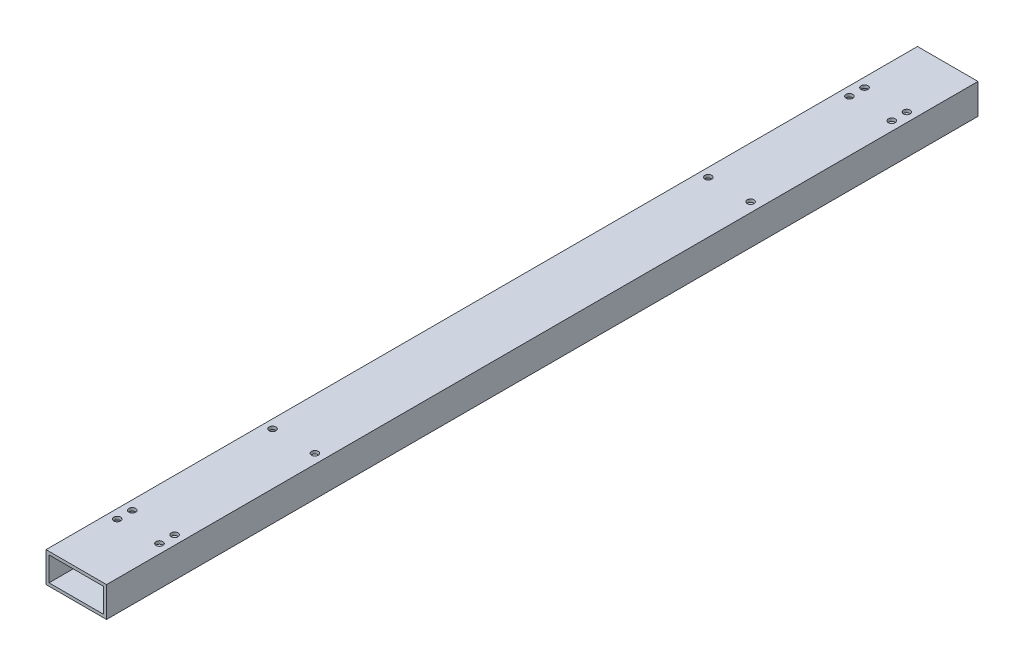
ISO-10303-21;
HEADER;
FILE_DESCRIPTION(('STEP AP214'),'2;1');
FILE_NAME('part.step','',(''),(''),'','','');
FILE_SCHEMA(('AUTOMOTIVE_DESIGN { 1 0 10303 214 1 1 1 1 }'));
ENDSEC;
DATA;
#1=APPLICATION_CONTEXT('core data for automotive mechanical design processes');
#2=APPLICATION_PROTOCOL_DEFINITION('international standard','automotive_design',2000,#1);
#3=PRODUCT_CONTEXT('',#1,'mechanical');
#4=PRODUCT('Part','Part','',(#3));
#5=PRODUCT_RELATED_PRODUCT_CATEGORY('part','',(#4));
#6=PRODUCT_DEFINITION_FORMATION('','',#4);
#7=PRODUCT_DEFINITION_CONTEXT('part definition',#1,'design');
#8=PRODUCT_DEFINITION('design','',#6,#7);
#9=PRODUCT_DEFINITION_SHAPE('','',#8);
#10=(LENGTH_UNIT() NAMED_UNIT(*) SI_UNIT(.MILLI.,.METRE.));
#11=(NAMED_UNIT(*) PLANE_ANGLE_UNIT() SI_UNIT($,.RADIAN.));
#12=(NAMED_UNIT(*) SI_UNIT($,.STERADIAN.) SOLID_ANGLE_UNIT());
#13=UNCERTAINTY_MEASURE_WITH_UNIT(LENGTH_MEASURE(1.E-05),#10,'distance_accuracy_value','');
#14=(GEOMETRIC_REPRESENTATION_CONTEXT(3) GLOBAL_UNCERTAINTY_ASSIGNED_CONTEXT((#13)) GLOBAL_UNIT_ASSIGNED_CONTEXT((#10,
#11,#12)) REPRESENTATION_CONTEXT('',''));
#15=CARTESIAN_POINT('',(0.,0.,0.));
#16=DIRECTION('',(0.,0.,1.));
#17=DIRECTION('',(1.,0.,0.));
#18=AXIS2_PLACEMENT_3D('',#15,#16,#17);
#19=CARTESIAN_POINT('',(-31.7499999999999,15.875,457.2));
#20=DIRECTION('',(0.,-1.,0.));
#21=DIRECTION('',(1.,0.,0.));
#22=AXIS2_PLACEMENT_3D('',#19,#20,#21);
#23=PLANE('',#22);
#24=CARTESIAN_POINT('',(-22.6771014244706,15.875,-228.6));
#25=DIRECTION('',(0.,1.,0.));
#26=DIRECTION('',(-1.,0.,0.));
#27=AXIS2_PLACEMENT_3D('',#24,#25,#26);
#28=CIRCLE('',#27,3.57251000000004);
#29=CARTESIAN_POINT('',(-26.2496114244707,15.875,-228.6));
#30=VERTEX_POINT('',#29);
#31=EDGE_CURVE('E463',#30,#30,#28,.T.);
#32=ORIENTED_EDGE('',*,*,#31,.F.);
#33=EDGE_LOOP('',(#32));
#34=FACE_BOUND('',#33,.T.);
#35=CARTESIAN_POINT('',(21.7728985755294,15.875,228.6));
#36=DIRECTION('',(0.,1.,0.));
#37=DIRECTION('',(1.,0.,0.));
#38=AXIS2_PLACEMENT_3D('',#35,#36,#37);
#39=CIRCLE('',#38,3.57251000000004);
#40=CARTESIAN_POINT('',(25.3454085755295,15.875,228.6));
#41=VERTEX_POINT('',#40);
#42=EDGE_CURVE('E455',#41,#41,#39,.T.);
#43=ORIENTED_EDGE('',*,*,#42,.F.);
#44=EDGE_LOOP('',(#43));
#45=FACE_BOUND('',#44,.T.);
#46=CARTESIAN_POINT('',(-22.6771014244706,15.875,228.6));
#47=DIRECTION('',(0.,1.,0.));
#48=DIRECTION('',(1.,0.,0.));
#49=AXIS2_PLACEMENT_3D('',#46,#47,#48);
#50=CIRCLE('',#49,3.57251000000004);
#51=CARTESIAN_POINT('',(-19.1045914244706,15.875,228.6));
#52=VERTEX_POINT('',#51);
#53=EDGE_CURVE('E449',#52,#52,#50,.T.);
#54=ORIENTED_EDGE('',*,*,#53,.F.);
#55=EDGE_LOOP('',(#54));
#56=FACE_BOUND('',#55,.T.);
#57=CARTESIAN_POINT('',(21.7728985755294,15.875,-228.6));
#58=DIRECTION('',(0.,1.,0.));
#59=DIRECTION('',(-1.,0.,0.));
#60=AXIS2_PLACEMENT_3D('',#57,#58,#59);
#61=CIRCLE('',#60,3.57251000000004);
#62=CARTESIAN_POINT('',(18.2003885755293,15.875,-228.6));
#63=VERTEX_POINT('',#62);
#64=EDGE_CURVE('E462',#63,#63,#61,.T.);
#65=ORIENTED_EDGE('',*,*,#64,.F.);
#66=EDGE_LOOP('',(#65));
#67=FACE_BOUND('',#66,.T.);
#68=CARTESIAN_POINT('',(-22.2250000000001,15.875,-376.2375));
#69=DIRECTION('',(0.,-1.,0.));
#70=DIRECTION('',(0.,0.,-1.));
#71=AXIS2_PLACEMENT_3D('',#68,#69,#70);
#72=CIRCLE('',#71,3.57187499999998);
#73=CARTESIAN_POINT('',(-22.2250000000001,15.875,-379.809375));
#74=VERTEX_POINT('',#73);
#75=EDGE_CURVE('E272',#74,#74,#72,.T.);
#76=ORIENTED_EDGE('',*,*,#75,.T.);
#77=EDGE_LOOP('',(#76));
#78=FACE_BOUND('',#77,.T.);
#79=CARTESIAN_POINT('',(22.2249999999999,15.875,392.1125));
#80=DIRECTION('',(0.,-1.,0.));
#81=DIRECTION('',(0.,0.,-1.));
#82=AXIS2_PLACEMENT_3D('',#79,#80,#81);
#83=CIRCLE('',#82,3.57187499999998);
#84=CARTESIAN_POINT('',(22.2249999999999,15.875,388.540625));
#85=VERTEX_POINT('',#84);
#86=EDGE_CURVE('E308',#85,#85,#83,.T.);
#87=ORIENTED_EDGE('',*,*,#86,.T.);
#88=EDGE_LOOP('',(#87));
#89=FACE_BOUND('',#88,.T.);
#90=CARTESIAN_POINT('',(22.2249999999999,15.875,-376.2375));
#91=DIRECTION('',(0.,-1.,0.));
#92=DIRECTION('',(0.,0.,-1.));
#93=AXIS2_PLACEMENT_3D('',#90,#91,#92);
#94=CIRCLE('',#93,3.57187499999998);
#95=CARTESIAN_POINT('',(22.2249999999999,15.875,-379.809375));
#96=VERTEX_POINT('',#95);
#97=EDGE_CURVE('E273',#96,#96,#94,.T.);
#98=ORIENTED_EDGE('',*,*,#97,.T.);
#99=EDGE_LOOP('',(#98));
#100=FACE_BOUND('',#99,.T.);
#101=CARTESIAN_POINT('',(-22.2250000000001,15.875,392.1125));
#102=DIRECTION('',(0.,-1.,0.));
#103=DIRECTION('',(0.,0.,-1.));
#104=AXIS2_PLACEMENT_3D('',#101,#102,#103);
#105=CIRCLE('',#104,3.57187499999998);
#106=CARTESIAN_POINT('',(-22.2250000000001,15.875,388.540625));
#107=VERTEX_POINT('',#106);
#108=EDGE_CURVE('E205',#107,#107,#105,.T.);
#109=ORIENTED_EDGE('',*,*,#108,.T.);
#110=EDGE_LOOP('',(#109));
#111=FACE_BOUND('',#110,.T.);
#112=DIRECTION('',(0.,0.,-1.));
#113=VECTOR('',#112,1.);
#114=CARTESIAN_POINT('',(31.75,15.875,457.2));
#115=LINE('',#114,#113);
#116=CARTESIAN_POINT('',(31.75,15.875,457.2));
#117=VERTEX_POINT('',#116);
#118=CARTESIAN_POINT('',(31.75,15.875,-457.2));
#119=VERTEX_POINT('',#118);
#120=EDGE_CURVE('E11',#117,#119,#115,.T.);
#121=ORIENTED_EDGE('',*,*,#120,.T.);
#122=DIRECTION('',(-1.,0.,0.));
#123=VECTOR('',#122,1.);
#124=CARTESIAN_POINT('',(-31.7499999999999,15.875,-457.2));
#125=LINE('',#124,#123);
#126=CARTESIAN_POINT('',(-31.7499999999999,15.875,-457.2));
#127=VERTEX_POINT('',#126);
#128=EDGE_CURVE('E155',#119,#127,#125,.T.);
#129=ORIENTED_EDGE('',*,*,#128,.T.);
#130=DIRECTION('',(0.,0.,-1.));
#131=VECTOR('',#130,1.);
#132=CARTESIAN_POINT('',(-31.7499999999999,15.875,457.2));
#133=LINE('',#132,#131);
#134=CARTESIAN_POINT('',(-31.7499999999999,15.875,457.2));
#135=VERTEX_POINT('',#134);
#136=EDGE_CURVE('E51',#135,#127,#133,.T.);
#137=ORIENTED_EDGE('',*,*,#136,.F.);
#138=DIRECTION('',(-1.,0.,0.));
#139=VECTOR('',#138,1.);
#140=CARTESIAN_POINT('',(-31.7499999999999,15.875,457.2));
#141=LINE('',#140,#139);
#142=EDGE_CURVE('E184',#117,#135,#141,.T.);
#143=ORIENTED_EDGE('',*,*,#142,.F.);
#144=EDGE_LOOP('',(#121,#129,#137,#143));
#145=FACE_BOUND('',#144,.T.);
#146=CARTESIAN_POINT('',(-22.2250000000001,15.875,376.2375));
#147=DIRECTION('',(0.,1.,0.));
#148=DIRECTION('',(0.,0.,1.));
#149=AXIS2_PLACEMENT_3D('',#146,#147,#148);
#150=CIRCLE('',#149,3.57187499999998);
#151=CARTESIAN_POINT('',(-22.2250000000001,15.875,379.809375));
#152=VERTEX_POINT('',#151);
#153=EDGE_CURVE('E268',#152,#152,#150,.T.);
#154=ORIENTED_EDGE('',*,*,#153,.F.);
#155=EDGE_LOOP('',(#154));
#156=FACE_BOUND('',#155,.T.);
#157=CARTESIAN_POINT('',(22.2249999999999,15.875,376.2375));
#158=DIRECTION('',(0.,1.,0.));
#159=DIRECTION('',(0.,0.,1.));
#160=AXIS2_PLACEMENT_3D('',#157,#158,#159);
#161=CIRCLE('',#160,3.57187499999998);
#162=CARTESIAN_POINT('',(22.2249999999999,15.875,379.809375));
#163=VERTEX_POINT('',#162);
#164=EDGE_CURVE('E280',#163,#163,#161,.T.);
#165=ORIENTED_EDGE('',*,*,#164,.F.);
#166=EDGE_LOOP('',(#165));
#167=FACE_BOUND('',#166,.T.);
#168=CARTESIAN_POINT('',(-22.2250000000001,15.875,-392.1125));
#169=DIRECTION('',(0.,1.,0.));
#170=DIRECTION('',(0.,0.,1.));
#171=AXIS2_PLACEMENT_3D('',#168,#169,#170);
#172=CIRCLE('',#171,3.57187499999998);
#173=CARTESIAN_POINT('',(-22.2250000000001,15.875,-388.540625));
#174=VERTEX_POINT('',#173);
#175=EDGE_CURVE('E294',#174,#174,#172,.T.);
#176=ORIENTED_EDGE('',*,*,#175,.F.);
#177=EDGE_LOOP('',(#176));
#178=FACE_BOUND('',#177,.T.);
#179=CARTESIAN_POINT('',(22.2249999999999,15.875,-392.1125));
#180=DIRECTION('',(0.,1.,0.));
#181=DIRECTION('',(0.,0.,1.));
#182=AXIS2_PLACEMENT_3D('',#179,#180,#181);
#183=CIRCLE('',#182,3.57187499999998);
#184=CARTESIAN_POINT('',(22.2249999999999,15.875,-388.540625));
#185=VERTEX_POINT('',#184);
#186=EDGE_CURVE('E295',#185,#185,#183,.T.);
#187=ORIENTED_EDGE('',*,*,#186,.F.);
#188=EDGE_LOOP('',(#187));
#189=FACE_BOUND('',#188,.T.);
#190=ADVANCED_FACE('F41',(#34,#45,#56,#67,#78,#89,#100,#111,#145,#156,#167,#178,#189),#23,.F.);
#191=CARTESIAN_POINT('',(-31.75,-15.875,457.2));
#192=DIRECTION('',(0.,1.,0.));
#193=DIRECTION('',(0.,0.,1.));
#194=AXIS2_PLACEMENT_3D('',#191,#192,#193);
#195=PLANE('',#194);
#196=CARTESIAN_POINT('',(-22.6771014244706,-15.875,-228.6));
#197=DIRECTION('',(0.,1.,0.));
#198=DIRECTION('',(-1.,0.,0.));
#199=AXIS2_PLACEMENT_3D('',#196,#197,#198);
#200=CIRCLE('',#199,3.57251000000004);
#201=CARTESIAN_POINT('',(-26.2496114244707,-15.875,-228.6));
#202=VERTEX_POINT('',#201);
#203=EDGE_CURVE('E458',#202,#202,#200,.T.);
#204=ORIENTED_EDGE('',*,*,#203,.T.);
#205=EDGE_LOOP('',(#204));
#206=FACE_BOUND('',#205,.T.);
#207=CARTESIAN_POINT('',(21.7728985755294,-15.875,228.6));
#208=DIRECTION('',(0.,1.,0.));
#209=DIRECTION('',(1.,0.,0.));
#210=AXIS2_PLACEMENT_3D('',#207,#208,#209);
#211=CIRCLE('',#210,3.57251000000004);
#212=CARTESIAN_POINT('',(25.3454085755295,-15.875,228.6));
#213=VERTEX_POINT('',#212);
#214=EDGE_CURVE('E467',#213,#213,#211,.T.);
#215=ORIENTED_EDGE('',*,*,#214,.T.);
#216=EDGE_LOOP('',(#215));
#217=FACE_BOUND('',#216,.T.);
#218=CARTESIAN_POINT('',(-22.6771014244706,-15.875,228.6));
#219=DIRECTION('',(0.,1.,0.));
#220=DIRECTION('',(1.,0.,0.));
#221=AXIS2_PLACEMENT_3D('',#218,#219,#220);
#222=CIRCLE('',#221,3.57251000000004);
#223=CARTESIAN_POINT('',(-19.1045914244705,-15.875,228.6));
#224=VERTEX_POINT('',#223);
#225=EDGE_CURVE('E451',#224,#224,#222,.T.);
#226=ORIENTED_EDGE('',*,*,#225,.T.);
#227=EDGE_LOOP('',(#226));
#228=FACE_BOUND('',#227,.T.);
#229=CARTESIAN_POINT('',(21.7728985755294,-15.875,-228.6));
#230=DIRECTION('',(0.,1.,0.));
#231=DIRECTION('',(-1.,0.,0.));
#232=AXIS2_PLACEMENT_3D('',#229,#230,#231);
#233=CIRCLE('',#232,3.57251000000004);
#234=CARTESIAN_POINT('',(18.2003885755293,-15.875,-228.6));
#235=VERTEX_POINT('',#234);
#236=EDGE_CURVE('E240',#235,#235,#233,.T.);
#237=ORIENTED_EDGE('',*,*,#236,.T.);
#238=EDGE_LOOP('',(#237));
#239=FACE_BOUND('',#238,.T.);
#240=CARTESIAN_POINT('',(-22.2250000000001,-15.875,-376.2375));
#241=DIRECTION('',(0.,-1.,0.));
#242=DIRECTION('',(0.,0.,-1.));
#243=AXIS2_PLACEMENT_3D('',#240,#241,#242);
#244=CIRCLE('',#243,3.57187499999998);
#245=CARTESIAN_POINT('',(-22.2250000000001,-15.875,-379.809375));
#246=VERTEX_POINT('',#245);
#247=EDGE_CURVE('E298',#246,#246,#244,.T.);
#248=ORIENTED_EDGE('',*,*,#247,.F.);
#249=EDGE_LOOP('',(#248));
#250=FACE_BOUND('',#249,.T.);
#251=CARTESIAN_POINT('',(22.2249999999999,-15.875,392.1125));
#252=DIRECTION('',(0.,-1.,0.));
#253=DIRECTION('',(0.,0.,-1.));
#254=AXIS2_PLACEMENT_3D('',#251,#252,#253);
#255=CIRCLE('',#254,3.57187499999998);
#256=CARTESIAN_POINT('',(22.2249999999999,-15.875,388.540625));
#257=VERTEX_POINT('',#256);
#258=EDGE_CURVE('E303',#257,#257,#255,.T.);
#259=ORIENTED_EDGE('',*,*,#258,.F.);
#260=EDGE_LOOP('',(#259));
#261=FACE_BOUND('',#260,.T.);
#262=CARTESIAN_POINT('',(22.2249999999999,-15.875,-376.2375));
#263=DIRECTION('',(0.,-1.,0.));
#264=DIRECTION('',(0.,0.,-1.));
#265=AXIS2_PLACEMENT_3D('',#262,#263,#264);
#266=CIRCLE('',#265,3.57187499999998);
#267=CARTESIAN_POINT('',(22.2249999999999,-15.875,-379.809375));
#268=VERTEX_POINT('',#267);
#269=EDGE_CURVE('E269',#268,#268,#266,.T.);
#270=ORIENTED_EDGE('',*,*,#269,.F.);
#271=EDGE_LOOP('',(#270));
#272=FACE_BOUND('',#271,.T.);
#273=CARTESIAN_POINT('',(-22.2250000000001,-15.875,392.1125));
#274=DIRECTION('',(0.,-1.,0.));
#275=DIRECTION('',(0.,0.,-1.));
#276=AXIS2_PLACEMENT_3D('',#273,#274,#275);
#277=CIRCLE('',#276,3.57187499999998);
#278=CARTESIAN_POINT('',(-22.2250000000001,-15.875,388.540625));
#279=VERTEX_POINT('',#278);
#280=EDGE_CURVE('E307',#279,#279,#277,.T.);
#281=ORIENTED_EDGE('',*,*,#280,.F.);
#282=EDGE_LOOP('',(#281));
#283=FACE_BOUND('',#282,.T.);
#284=DIRECTION('',(0.,0.,-1.));
#285=VECTOR('',#284,1.);
#286=CARTESIAN_POINT('',(-31.75,-15.875,457.2));
#287=LINE('',#286,#285);
#288=CARTESIAN_POINT('',(-31.75,-15.875,457.2));
#289=VERTEX_POINT('',#288);
#290=CARTESIAN_POINT('',(-31.75,-15.875,-457.2));
#291=VERTEX_POINT('',#290);
#292=EDGE_CURVE('E195',#289,#291,#287,.T.);
#293=ORIENTED_EDGE('',*,*,#292,.T.);
#294=DIRECTION('',(1.,0.,0.));
#295=VECTOR('',#294,1.);
#296=CARTESIAN_POINT('',(-31.75,-15.875,-457.2));
#297=LINE('',#296,#295);
#298=CARTESIAN_POINT('',(31.75,-15.875,-457.2));
#299=VERTEX_POINT('',#298);
#300=EDGE_CURVE('E161',#291,#299,#297,.T.);
#301=ORIENTED_EDGE('',*,*,#300,.T.);
#302=DIRECTION('',(0.,0.,-1.));
#303=VECTOR('',#302,1.);
#304=CARTESIAN_POINT('',(31.75,-15.875,457.2));
#305=LINE('',#304,#303);
#306=CARTESIAN_POINT('',(31.75,-15.875,457.2));
#307=VERTEX_POINT('',#306);
#308=EDGE_CURVE('E192',#307,#299,#305,.T.);
#309=ORIENTED_EDGE('',*,*,#308,.F.);
#310=DIRECTION('',(1.,0.,0.));
#311=VECTOR('',#310,1.);
#312=CARTESIAN_POINT('',(-31.75,-15.875,457.2));
#313=LINE('',#312,#311);
#314=EDGE_CURVE('E70',#289,#307,#313,.T.);
#315=ORIENTED_EDGE('',*,*,#314,.F.);
#316=EDGE_LOOP('',(#293,#301,#309,#315));
#317=FACE_BOUND('',#316,.T.);
#318=CARTESIAN_POINT('',(-22.2250000000001,-15.875,376.2375));
#319=DIRECTION('',(0.,1.,0.));
#320=DIRECTION('',(0.,0.,1.));
#321=AXIS2_PLACEMENT_3D('',#318,#319,#320);
#322=CIRCLE('',#321,3.57187499999998);
#323=CARTESIAN_POINT('',(-22.2250000000001,-15.875,379.809375));
#324=VERTEX_POINT('',#323);
#325=EDGE_CURVE('E284',#324,#324,#322,.T.);
#326=ORIENTED_EDGE('',*,*,#325,.T.);
#327=EDGE_LOOP('',(#326));
#328=FACE_BOUND('',#327,.T.);
#329=CARTESIAN_POINT('',(22.2249999999999,-15.875,376.2375));
#330=DIRECTION('',(0.,1.,0.));
#331=DIRECTION('',(0.,0.,1.));
#332=AXIS2_PLACEMENT_3D('',#329,#330,#331);
#333=CIRCLE('',#332,3.57187499999998);
#334=CARTESIAN_POINT('',(22.2249999999999,-15.875,379.809375));
#335=VERTEX_POINT('',#334);
#336=EDGE_CURVE('E276',#335,#335,#333,.T.);
#337=ORIENTED_EDGE('',*,*,#336,.T.);
#338=EDGE_LOOP('',(#337));
#339=FACE_BOUND('',#338,.T.);
#340=CARTESIAN_POINT('',(-22.2250000000001,-15.875,-392.1125));
#341=DIRECTION('',(0.,1.,0.));
#342=DIRECTION('',(0.,0.,1.));
#343=AXIS2_PLACEMENT_3D('',#340,#341,#342);
#344=CIRCLE('',#343,3.57187499999998);
#345=CARTESIAN_POINT('',(-22.2250000000001,-15.875,-388.540625));
#346=VERTEX_POINT('',#345);
#347=EDGE_CURVE('E312',#346,#346,#344,.T.);
#348=ORIENTED_EDGE('',*,*,#347,.T.);
#349=EDGE_LOOP('',(#348));
#350=FACE_BOUND('',#349,.T.);
#351=CARTESIAN_POINT('',(22.2249999999999,-15.875,-392.1125));
#352=DIRECTION('',(0.,1.,0.));
#353=DIRECTION('',(0.,0.,1.));
#354=AXIS2_PLACEMENT_3D('',#351,#352,#353);
#355=CIRCLE('',#354,3.57187499999998);
#356=CARTESIAN_POINT('',(22.2249999999999,-15.875,-388.540625));
#357=VERTEX_POINT('',#356);
#358=EDGE_CURVE('E291',#357,#357,#355,.T.);
#359=ORIENTED_EDGE('',*,*,#358,.T.);
#360=EDGE_LOOP('',(#359));
#361=FACE_BOUND('',#360,.T.);
#362=ADVANCED_FACE('F352',(#206,#217,#228,#239,#250,#261,#272,#283,#317,#328,#339,#350,#361),
#195,.F.);
#363=CARTESIAN_POINT('',(-28.575,12.7,457.2));
#364=DIRECTION('',(0.,-1.,0.));
#365=DIRECTION('',(0.,0.,-1.));
#366=AXIS2_PLACEMENT_3D('',#363,#364,#365);
#367=PLANE('',#366);
#368=CARTESIAN_POINT('',(-22.6771014244706,12.7,-228.6));
#369=DIRECTION('',(0.,-1.,0.));
#370=DIRECTION('',(0.,0.,-1.));
#371=AXIS2_PLACEMENT_3D('',#368,#369,#370);
#372=CIRCLE('',#371,3.57251000000004);
#373=CARTESIAN_POINT('',(-22.6771014244706,12.7,-232.17251));
#374=VERTEX_POINT('',#373);
#375=EDGE_CURVE('E264',#374,#374,#372,.T.);
#376=ORIENTED_EDGE('',*,*,#375,.F.);
#377=EDGE_LOOP('',(#376));
#378=FACE_BOUND('',#377,.T.);
#379=CARTESIAN_POINT('',(21.7728985755294,12.7,228.6));
#380=DIRECTION('',(0.,-1.,0.));
#381=DIRECTION('',(0.,0.,-1.));
#382=AXIS2_PLACEMENT_3D('',#379,#380,#381);
#383=CIRCLE('',#382,3.57251000000004);
#384=CARTESIAN_POINT('',(21.7728985755294,12.7,225.02749));
#385=VERTEX_POINT('',#384);
#386=EDGE_CURVE('E248',#385,#385,#383,.T.);
#387=ORIENTED_EDGE('',*,*,#386,.F.);
#388=EDGE_LOOP('',(#387));
#389=FACE_BOUND('',#388,.T.);
#390=CARTESIAN_POINT('',(-22.6771014244706,12.7,228.6));
#391=DIRECTION('',(0.,-1.,0.));
#392=DIRECTION('',(0.,0.,-1.));
#393=AXIS2_PLACEMENT_3D('',#390,#391,#392);
#394=CIRCLE('',#393,3.57251000000004);
#395=CARTESIAN_POINT('',(-22.6771014244706,12.7,225.02749));
#396=VERTEX_POINT('',#395);
#397=EDGE_CURVE('E244',#396,#396,#394,.T.);
#398=ORIENTED_EDGE('',*,*,#397,.F.);
#399=EDGE_LOOP('',(#398));
#400=FACE_BOUND('',#399,.T.);
#401=CARTESIAN_POINT('',(21.7728985755294,12.7,-228.6));
#402=DIRECTION('',(0.,-1.,0.));
#403=DIRECTION('',(0.,0.,-1.));
#404=AXIS2_PLACEMENT_3D('',#401,#402,#403);
#405=CIRCLE('',#404,3.57251000000004);
#406=CARTESIAN_POINT('',(21.7728985755294,12.7,-232.17251));
#407=VERTEX_POINT('',#406);
#408=EDGE_CURVE('E239',#407,#407,#405,.T.);
#409=ORIENTED_EDGE('',*,*,#408,.F.);
#410=EDGE_LOOP('',(#409));
#411=FACE_BOUND('',#410,.T.);
#412=CARTESIAN_POINT('',(-22.2250000000001,12.7,-376.2375));
#413=DIRECTION('',(0.,-1.,0.));
#414=DIRECTION('',(0.,0.,-1.));
#415=AXIS2_PLACEMENT_3D('',#412,#413,#414);
#416=CIRCLE('',#415,3.57187499999998);
#417=CARTESIAN_POINT('',(-22.2250000000001,12.7,-379.809375));
#418=VERTEX_POINT('',#417);
#419=EDGE_CURVE('E143',#418,#418,#416,.T.);
#420=ORIENTED_EDGE('',*,*,#419,.F.);
#421=EDGE_LOOP('',(#420));
#422=FACE_BOUND('',#421,.T.);
#423=CARTESIAN_POINT('',(-22.2250000000001,12.7,-392.1125));
#424=DIRECTION('',(0.,-1.,0.));
#425=DIRECTION('',(0.,0.,-1.));
#426=AXIS2_PLACEMENT_3D('',#423,#424,#425);
#427=CIRCLE('',#426,3.57187499999998);
#428=CARTESIAN_POINT('',(-22.2250000000001,12.7,-395.684375));
#429=VERTEX_POINT('',#428);
#430=EDGE_CURVE('E228',#429,#429,#427,.F.);
#431=ORIENTED_EDGE('',*,*,#430,.T.);
#432=EDGE_LOOP('',(#431));
#433=FACE_BOUND('',#432,.T.);
#434=CARTESIAN_POINT('',(22.2249999999999,12.7,392.1125));
#435=DIRECTION('',(0.,-1.,0.));
#436=DIRECTION('',(0.,0.,-1.));
#437=AXIS2_PLACEMENT_3D('',#434,#435,#436);
#438=CIRCLE('',#437,3.57187499999998);
#439=CARTESIAN_POINT('',(22.2249999999999,12.7,388.540625));
#440=VERTEX_POINT('',#439);
#441=EDGE_CURVE('E224',#440,#440,#438,.T.);
#442=ORIENTED_EDGE('',*,*,#441,.F.);
#443=EDGE_LOOP('',(#442));
#444=FACE_BOUND('',#443,.T.);
#445=CARTESIAN_POINT('',(22.2249999999999,12.7,-376.2375));
#446=DIRECTION('',(0.,-1.,0.));
#447=DIRECTION('',(0.,0.,-1.));
#448=AXIS2_PLACEMENT_3D('',#445,#446,#447);
#449=CIRCLE('',#448,3.57187499999998);
#450=CARTESIAN_POINT('',(22.2249999999999,12.7,-379.809375));
#451=VERTEX_POINT('',#450);
#452=EDGE_CURVE('E219',#451,#451,#449,.T.);
#453=ORIENTED_EDGE('',*,*,#452,.F.);
#454=EDGE_LOOP('',(#453));
#455=FACE_BOUND('',#454,.T.);
#456=CARTESIAN_POINT('',(-22.2250000000001,12.7,376.2375));
#457=DIRECTION('',(0.,-1.,0.));
#458=DIRECTION('',(0.,0.,-1.));
#459=AXIS2_PLACEMENT_3D('',#456,#457,#458);
#460=CIRCLE('',#459,3.57187499999998);
#461=CARTESIAN_POINT('',(-22.2250000000001,12.7,372.665625));
#462=VERTEX_POINT('',#461);
#463=EDGE_CURVE('E210',#462,#462,#460,.F.);
#464=ORIENTED_EDGE('',*,*,#463,.T.);
#465=EDGE_LOOP('',(#464));
#466=FACE_BOUND('',#465,.T.);
#467=CARTESIAN_POINT('',(-22.2250000000001,12.7,392.1125));
#468=DIRECTION('',(0.,-1.,0.));
#469=DIRECTION('',(0.,0.,-1.));
#470=AXIS2_PLACEMENT_3D('',#467,#468,#469);
#471=CIRCLE('',#470,3.57187499999998);
#472=CARTESIAN_POINT('',(-22.2250000000001,12.7,388.540625));
#473=VERTEX_POINT('',#472);
#474=EDGE_CURVE('E204',#473,#473,#471,.T.);
#475=ORIENTED_EDGE('',*,*,#474,.F.);
#476=EDGE_LOOP('',(#475));
#477=FACE_BOUND('',#476,.T.);
#478=DIRECTION('',(0.,0.,-1.));
#479=VECTOR('',#478,1.);
#480=CARTESIAN_POINT('',(-28.575,12.7,457.2));
#481=LINE('',#480,#479);
#482=CARTESIAN_POINT('',(-28.575,12.7,457.2));
#483=VERTEX_POINT('',#482);
#484=CARTESIAN_POINT('',(-28.575,12.7,-457.2));
#485=VERTEX_POINT('',#484);
#486=EDGE_CURVE('E128',#483,#485,#481,.T.);
#487=ORIENTED_EDGE('',*,*,#486,.T.);
#488=DIRECTION('',(-1.,0.,0.));
#489=VECTOR('',#488,1.);
#490=CARTESIAN_POINT('',(-28.575,12.7,-457.2));
#491=LINE('',#490,#489);
#492=CARTESIAN_POINT('',(28.575,12.7,-457.2));
#493=VERTEX_POINT('',#492);
#494=EDGE_CURVE('E131',#493,#485,#491,.T.);
#495=ORIENTED_EDGE('',*,*,#494,.F.);
#496=DIRECTION('',(0.,0.,-1.));
#497=VECTOR('',#496,1.);
#498=CARTESIAN_POINT('',(28.575,12.7,457.2));
#499=LINE('',#498,#497);
#500=CARTESIAN_POINT('',(28.575,12.7,457.2));
#501=VERTEX_POINT('',#500);
#502=EDGE_CURVE('E115',#501,#493,#499,.T.);
#503=ORIENTED_EDGE('',*,*,#502,.F.);
#504=DIRECTION('',(-1.,0.,0.));
#505=VECTOR('',#504,1.);
#506=CARTESIAN_POINT('',(-28.575,12.7,457.2));
#507=LINE('',#506,#505);
#508=EDGE_CURVE('E166',#501,#483,#507,.T.);
#509=ORIENTED_EDGE('',*,*,#508,.T.);
#510=EDGE_LOOP('',(#487,#495,#503,#509));
#511=FACE_BOUND('',#510,.T.);
#512=CARTESIAN_POINT('',(22.2249999999999,12.7,376.2375));
#513=DIRECTION('',(0.,-1.,0.));
#514=DIRECTION('',(0.,0.,-1.));
#515=AXIS2_PLACEMENT_3D('',#512,#513,#514);
#516=CIRCLE('',#515,3.57187499999998);
#517=CARTESIAN_POINT('',(22.2249999999999,12.7,372.665625));
#518=VERTEX_POINT('',#517);
#519=EDGE_CURVE('E215',#518,#518,#516,.F.);
#520=ORIENTED_EDGE('',*,*,#519,.T.);
#521=EDGE_LOOP('',(#520));
#522=FACE_BOUND('',#521,.T.);
#523=CARTESIAN_POINT('',(22.2249999999999,12.7,-392.1125));
#524=DIRECTION('',(0.,-1.,0.));
#525=DIRECTION('',(0.,0.,-1.));
#526=AXIS2_PLACEMENT_3D('',#523,#524,#525);
#527=CIRCLE('',#526,3.57187499999998);
#528=CARTESIAN_POINT('',(22.2249999999999,12.7,-395.684375));
#529=VERTEX_POINT('',#528);
#530=EDGE_CURVE('E232',#529,#529,#527,.F.);
#531=ORIENTED_EDGE('',*,*,#530,.T.);
#532=EDGE_LOOP('',(#531));
#533=FACE_BOUND('',#532,.T.);
#534=ADVANCED_FACE('F132',(#378,#389,#400,#411,#422,#433,#444,#455,#466,#477,#511,#522,#533),
#367,.T.);
#535=CARTESIAN_POINT('',(-28.575,-12.7,457.2));
#536=DIRECTION('',(0.,1.,0.));
#537=DIRECTION('',(0.,0.,1.));
#538=AXIS2_PLACEMENT_3D('',#535,#536,#537);
#539=PLANE('',#538);
#540=CARTESIAN_POINT('',(-22.6771014244706,-12.7,-228.6));
#541=DIRECTION('',(0.,1.,0.));
#542=DIRECTION('',(0.,0.,1.));
#543=AXIS2_PLACEMENT_3D('',#540,#541,#542);
#544=CIRCLE('',#543,3.57251000000004);
#545=CARTESIAN_POINT('',(-22.6771014244706,-12.7,-225.02749));
#546=VERTEX_POINT('',#545);
#547=EDGE_CURVE('E45',#546,#546,#544,.T.);
#548=ORIENTED_EDGE('',*,*,#547,.F.);
#549=EDGE_LOOP('',(#548));
#550=FACE_BOUND('',#549,.T.);
#551=CARTESIAN_POINT('',(21.7728985755294,-12.7,228.6));
#552=DIRECTION('',(0.,1.,0.));
#553=DIRECTION('',(0.,0.,1.));
#554=AXIS2_PLACEMENT_3D('',#551,#552,#553);
#555=CIRCLE('',#554,3.57251000000004);
#556=CARTESIAN_POINT('',(21.7728985755294,-12.7,232.17251));
#557=VERTEX_POINT('',#556);
#558=EDGE_CURVE('E245',#557,#557,#555,.T.);
#559=ORIENTED_EDGE('',*,*,#558,.F.);
#560=EDGE_LOOP('',(#559));
#561=FACE_BOUND('',#560,.T.);
#562=CARTESIAN_POINT('',(-22.6771014244706,-12.7,228.6));
#563=DIRECTION('',(0.,1.,0.));
#564=DIRECTION('',(0.,0.,1.));
#565=AXIS2_PLACEMENT_3D('',#562,#563,#564);
#566=CIRCLE('',#565,3.57251000000004);
#567=CARTESIAN_POINT('',(-22.6771014244706,-12.7,232.17251));
#568=VERTEX_POINT('',#567);
#569=EDGE_CURVE('E241',#568,#568,#566,.T.);
#570=ORIENTED_EDGE('',*,*,#569,.F.);
#571=EDGE_LOOP('',(#570));
#572=FACE_BOUND('',#571,.T.);
#573=CARTESIAN_POINT('',(21.7728985755294,-12.7,-228.6));
#574=DIRECTION('',(0.,1.,0.));
#575=DIRECTION('',(0.,0.,1.));
#576=AXIS2_PLACEMENT_3D('',#573,#574,#575);
#577=CIRCLE('',#576,3.57251000000004);
#578=CARTESIAN_POINT('',(21.7728985755294,-12.7,-225.02749));
#579=VERTEX_POINT('',#578);
#580=EDGE_CURVE('E235',#579,#579,#577,.T.);
#581=ORIENTED_EDGE('',*,*,#580,.F.);
#582=EDGE_LOOP('',(#581));
#583=FACE_BOUND('',#582,.T.);
#584=CARTESIAN_POINT('',(-22.2250000000001,-12.7,-376.2375));
#585=DIRECTION('',(0.,1.,0.));
#586=DIRECTION('',(0.,0.,1.));
#587=AXIS2_PLACEMENT_3D('',#584,#585,#586);
#588=CIRCLE('',#587,3.57187499999998);
#589=CARTESIAN_POINT('',(-22.2250000000001,-12.7,-372.665625));
#590=VERTEX_POINT('',#589);
#591=EDGE_CURVE('E146',#590,#590,#588,.T.);
#592=ORIENTED_EDGE('',*,*,#591,.F.);
#593=EDGE_LOOP('',(#592));
#594=FACE_BOUND('',#593,.T.);
#595=CARTESIAN_POINT('',(-22.2250000000001,-12.7,-392.1125));
#596=DIRECTION('',(0.,1.,0.));
#597=DIRECTION('',(0.,0.,1.));
#598=AXIS2_PLACEMENT_3D('',#595,#596,#597);
#599=CIRCLE('',#598,3.57187499999998);
#600=CARTESIAN_POINT('',(-22.2250000000001,-12.7,-388.540625));
#601=VERTEX_POINT('',#600);
#602=EDGE_CURVE('E225',#601,#601,#599,.F.);
#603=ORIENTED_EDGE('',*,*,#602,.T.);
#604=EDGE_LOOP('',(#603));
#605=FACE_BOUND('',#604,.T.);
#606=CARTESIAN_POINT('',(22.2249999999999,-12.7,392.1125));
#607=DIRECTION('',(0.,1.,0.));
#608=DIRECTION('',(0.,0.,1.));
#609=AXIS2_PLACEMENT_3D('',#606,#607,#608);
#610=CIRCLE('',#609,3.57187499999998);
#611=CARTESIAN_POINT('',(22.2249999999999,-12.7,395.684375));
#612=VERTEX_POINT('',#611);
#613=EDGE_CURVE('E220',#612,#612,#610,.T.);
#614=ORIENTED_EDGE('',*,*,#613,.F.);
#615=EDGE_LOOP('',(#614));
#616=FACE_BOUND('',#615,.T.);
#617=CARTESIAN_POINT('',(22.2249999999999,-12.7,-376.2375));
#618=DIRECTION('',(0.,1.,0.));
#619=DIRECTION('',(0.,0.,1.));
#620=AXIS2_PLACEMENT_3D('',#617,#618,#619);
#621=CIRCLE('',#620,3.57187499999998);
#622=CARTESIAN_POINT('',(22.2249999999999,-12.7,-372.665625));
#623=VERTEX_POINT('',#622);
#624=EDGE_CURVE('E216',#623,#623,#621,.T.);
#625=ORIENTED_EDGE('',*,*,#624,.F.);
#626=EDGE_LOOP('',(#625));
#627=FACE_BOUND('',#626,.T.);
#628=CARTESIAN_POINT('',(-22.2250000000001,-12.7,376.2375));
#629=DIRECTION('',(0.,1.,0.));
#630=DIRECTION('',(0.,0.,1.));
#631=AXIS2_PLACEMENT_3D('',#628,#629,#630);
#632=CIRCLE('',#631,3.57187499999998);
#633=CARTESIAN_POINT('',(-22.2250000000001,-12.7,379.809375));
#634=VERTEX_POINT('',#633);
#635=EDGE_CURVE('E206',#634,#634,#632,.F.);
#636=ORIENTED_EDGE('',*,*,#635,.T.);
#637=EDGE_LOOP('',(#636));
#638=FACE_BOUND('',#637,.T.);
#639=CARTESIAN_POINT('',(-22.2250000000001,-12.7,392.1125));
#640=DIRECTION('',(0.,1.,0.));
#641=DIRECTION('',(0.,0.,1.));
#642=AXIS2_PLACEMENT_3D('',#639,#640,#641);
#643=CIRCLE('',#642,3.57187499999998);
#644=CARTESIAN_POINT('',(-22.2250000000001,-12.7,395.684375));
#645=VERTEX_POINT('',#644);
#646=EDGE_CURVE('E200',#645,#645,#643,.T.);
#647=ORIENTED_EDGE('',*,*,#646,.F.);
#648=EDGE_LOOP('',(#647));
#649=FACE_BOUND('',#648,.T.);
#650=DIRECTION('',(0.,0.,-1.));
#651=VECTOR('',#650,1.);
#652=CARTESIAN_POINT('',(28.575,-12.7,457.2));
#653=LINE('',#652,#651);
#654=CARTESIAN_POINT('',(28.575,-12.7,457.2));
#655=VERTEX_POINT('',#654);
#656=CARTESIAN_POINT('',(28.575,-12.7,-457.2));
#657=VERTEX_POINT('',#656);
#658=EDGE_CURVE('E175',#655,#657,#653,.T.);
#659=ORIENTED_EDGE('',*,*,#658,.T.);
#660=DIRECTION('',(1.,0.,0.));
#661=VECTOR('',#660,1.);
#662=CARTESIAN_POINT('',(-28.575,-12.7,-457.2));
#663=LINE('',#662,#661);
#664=CARTESIAN_POINT('',(-28.575,-12.7,-457.2));
#665=VERTEX_POINT('',#664);
#666=EDGE_CURVE('E142',#665,#657,#663,.T.);
#667=ORIENTED_EDGE('',*,*,#666,.F.);
#668=DIRECTION('',(0.,0.,-1.));
#669=VECTOR('',#668,1.);
#670=CARTESIAN_POINT('',(-28.575,-12.7,457.2));
#671=LINE('',#670,#669);
#672=CARTESIAN_POINT('',(-28.575,-12.7,457.2));
#673=VERTEX_POINT('',#672);
#674=EDGE_CURVE('E62',#673,#665,#671,.T.);
#675=ORIENTED_EDGE('',*,*,#674,.F.);
#676=DIRECTION('',(1.,0.,0.));
#677=VECTOR('',#676,1.);
#678=CARTESIAN_POINT('',(-28.575,-12.7,457.2));
#679=LINE('',#678,#677);
#680=EDGE_CURVE('E172',#673,#655,#679,.T.);
#681=ORIENTED_EDGE('',*,*,#680,.T.);
#682=EDGE_LOOP('',(#659,#667,#675,#681));
#683=FACE_BOUND('',#682,.T.);
#684=CARTESIAN_POINT('',(22.2249999999999,-12.7,376.2375));
#685=DIRECTION('',(0.,1.,0.));
#686=DIRECTION('',(0.,0.,1.));
#687=AXIS2_PLACEMENT_3D('',#684,#685,#686);
#688=CIRCLE('',#687,3.57187499999998);
#689=CARTESIAN_POINT('',(22.2249999999999,-12.7,379.809375));
#690=VERTEX_POINT('',#689);
#691=EDGE_CURVE('E211',#690,#690,#688,.F.);
#692=ORIENTED_EDGE('',*,*,#691,.T.);
#693=EDGE_LOOP('',(#692));
#694=FACE_BOUND('',#693,.T.);
#695=CARTESIAN_POINT('',(22.2249999999999,-12.7,-392.1125));
#696=DIRECTION('',(0.,1.,0.));
#697=DIRECTION('',(0.,0.,1.));
#698=AXIS2_PLACEMENT_3D('',#695,#696,#697);
#699=CIRCLE('',#698,3.57187499999998);
#700=CARTESIAN_POINT('',(22.2249999999999,-12.7,-388.540625));
#701=VERTEX_POINT('',#700);
#702=EDGE_CURVE('E229',#701,#701,#699,.F.);
#703=ORIENTED_EDGE('',*,*,#702,.T.);
#704=EDGE_LOOP('',(#703));
#705=FACE_BOUND('',#704,.T.);
#706=ADVANCED_FACE('F370',(#550,#561,#572,#583,#594,#605,#616,#627,#638,#649,#683,#694,#705),
#539,.T.);
#707=CARTESIAN_POINT('',(0.,0.,457.2));
#708=DIRECTION('',(0.,0.,1.));
#709=DIRECTION('',(1.,0.,0.));
#710=AXIS2_PLACEMENT_3D('',#707,#708,#709);
#711=PLANE('',#710);
#712=DIRECTION('',(0.,1.,0.));
#713=VECTOR('',#712,1.);
#714=CARTESIAN_POINT('',(31.75,15.875,457.2));
#715=LINE('',#714,#713);
#716=EDGE_CURVE('E127',#307,#117,#715,.T.);
#717=ORIENTED_EDGE('',*,*,#716,.T.);
#718=ORIENTED_EDGE('',*,*,#142,.T.);
#719=DIRECTION('',(0.,-1.,0.));
#720=VECTOR('',#719,1.);
#721=CARTESIAN_POINT('',(-31.7499999999999,15.875,457.2));
#722=LINE('',#721,#720);
#723=EDGE_CURVE('E187',#135,#289,#722,.T.);
#724=ORIENTED_EDGE('',*,*,#723,.T.);
#725=ORIENTED_EDGE('',*,*,#314,.T.);
#726=EDGE_LOOP('',(#717,#718,#724,#725));
#727=FACE_BOUND('',#726,.T.);
#728=ORIENTED_EDGE('',*,*,#508,.F.);
#729=DIRECTION('',(0.,1.,0.));
#730=VECTOR('',#729,1.);
#731=CARTESIAN_POINT('',(28.575,12.7,457.2));
#732=LINE('',#731,#730);
#733=EDGE_CURVE('E123',#655,#501,#732,.T.);
#734=ORIENTED_EDGE('',*,*,#733,.F.);
#735=ORIENTED_EDGE('',*,*,#680,.F.);
#736=DIRECTION('',(0.,-1.,0.));
#737=VECTOR('',#736,1.);
#738=CARTESIAN_POINT('',(-28.575,12.7,457.2));
#739=LINE('',#738,#737);
#740=EDGE_CURVE('E169',#483,#673,#739,.T.);
#741=ORIENTED_EDGE('',*,*,#740,.F.);
#742=EDGE_LOOP('',(#728,#734,#735,#741));
#743=FACE_BOUND('',#742,.T.);
#744=ADVANCED_FACE('F367',(#727,#743),#711,.T.);
#745=CARTESIAN_POINT('',(31.75,15.875,457.2));
#746=DIRECTION('',(-1.,0.,0.));
#747=DIRECTION('',(0.,-1.,0.));
#748=AXIS2_PLACEMENT_3D('',#745,#746,#747);
#749=PLANE('',#748);
#750=ORIENTED_EDGE('',*,*,#308,.T.);
#751=DIRECTION('',(0.,1.,0.));
#752=VECTOR('',#751,1.);
#753=CARTESIAN_POINT('',(31.75,15.875,-457.2));
#754=LINE('',#753,#752);
#755=EDGE_CURVE('E152',#299,#119,#754,.T.);
#756=ORIENTED_EDGE('',*,*,#755,.T.);
#757=ORIENTED_EDGE('',*,*,#120,.F.);
#758=ORIENTED_EDGE('',*,*,#716,.F.);
#759=EDGE_LOOP('',(#750,#756,#757,#758));
#760=FACE_BOUND('',#759,.T.);
#761=ADVANCED_FACE('F43',(#760),#749,.F.);
#762=CARTESIAN_POINT('',(-31.7499999999999,15.875,457.2));
#763=DIRECTION('',(1.,0.,0.));
#764=DIRECTION('',(0.,1.,0.));
#765=AXIS2_PLACEMENT_3D('',#762,#763,#764);
#766=PLANE('',#765);
#767=ORIENTED_EDGE('',*,*,#136,.T.);
#768=DIRECTION('',(0.,-1.,0.));
#769=VECTOR('',#768,1.);
#770=CARTESIAN_POINT('',(-31.7499999999999,15.875,-457.2));
#771=LINE('',#770,#769);
#772=EDGE_CURVE('E158',#127,#291,#771,.T.);
#773=ORIENTED_EDGE('',*,*,#772,.T.);
#774=ORIENTED_EDGE('',*,*,#292,.F.);
#775=ORIENTED_EDGE('',*,*,#723,.F.);
#776=EDGE_LOOP('',(#767,#773,#774,#775));
#777=FACE_BOUND('',#776,.T.);
#778=ADVANCED_FACE('F363',(#777),#766,.F.);
#779=CARTESIAN_POINT('',(28.575,12.7,457.2));
#780=DIRECTION('',(-1.,0.,0.));
#781=DIRECTION('',(0.,0.,1.));
#782=AXIS2_PLACEMENT_3D('',#779,#780,#781);
#783=PLANE('',#782);
#784=ORIENTED_EDGE('',*,*,#502,.T.);
#785=DIRECTION('',(0.,1.,0.));
#786=VECTOR('',#785,1.);
#787=CARTESIAN_POINT('',(28.575,12.7,-457.2));
#788=LINE('',#787,#786);
#789=EDGE_CURVE('E120',#657,#493,#788,.T.);
#790=ORIENTED_EDGE('',*,*,#789,.F.);
#791=ORIENTED_EDGE('',*,*,#658,.F.);
#792=ORIENTED_EDGE('',*,*,#733,.T.);
#793=EDGE_LOOP('',(#784,#790,#791,#792));
#794=FACE_BOUND('',#793,.T.);
#795=ADVANCED_FACE('F117',(#794),#783,.T.);
#796=CARTESIAN_POINT('',(-28.575,12.7,457.2));
#797=DIRECTION('',(1.,0.,0.));
#798=DIRECTION('',(0.,0.,-1.));
#799=AXIS2_PLACEMENT_3D('',#796,#797,#798);
#800=PLANE('',#799);
#801=ORIENTED_EDGE('',*,*,#674,.T.);
#802=DIRECTION('',(0.,-1.,0.));
#803=VECTOR('',#802,1.);
#804=CARTESIAN_POINT('',(-28.575,12.7,-457.2));
#805=LINE('',#804,#803);
#806=EDGE_CURVE('E138',#485,#665,#805,.T.);
#807=ORIENTED_EDGE('',*,*,#806,.F.);
#808=ORIENTED_EDGE('',*,*,#486,.F.);
#809=ORIENTED_EDGE('',*,*,#740,.T.);
#810=EDGE_LOOP('',(#801,#807,#808,#809));
#811=FACE_BOUND('',#810,.T.);
#812=ADVANCED_FACE('F373',(#811),#800,.T.);
#813=CARTESIAN_POINT('',(0.,0.,-457.2));
#814=DIRECTION('',(0.,0.,1.));
#815=DIRECTION('',(1.,0.,0.));
#816=AXIS2_PLACEMENT_3D('',#813,#814,#815);
#817=PLANE('',#816);
#818=ORIENTED_EDGE('',*,*,#666,.T.);
#819=ORIENTED_EDGE('',*,*,#789,.T.);
#820=ORIENTED_EDGE('',*,*,#494,.T.);
#821=ORIENTED_EDGE('',*,*,#806,.T.);
#822=EDGE_LOOP('',(#818,#819,#820,#821));
#823=FACE_BOUND('',#822,.T.);
#824=ORIENTED_EDGE('',*,*,#755,.F.);
#825=ORIENTED_EDGE('',*,*,#300,.F.);
#826=ORIENTED_EDGE('',*,*,#772,.F.);
#827=ORIENTED_EDGE('',*,*,#128,.F.);
#828=EDGE_LOOP('',(#824,#825,#826,#827));
#829=FACE_BOUND('',#828,.T.);
#830=ADVANCED_FACE('F140',(#823,#829),#817,.F.);
#831=CARTESIAN_POINT('',(-22.2250000000001,15.875,392.1125));
#832=DIRECTION('',(0.,-1.,0.));
#833=DIRECTION('',(0.,0.,-1.));
#834=AXIS2_PLACEMENT_3D('',#831,#832,#833);
#835=CYLINDRICAL_SURFACE('',#834,3.57187499999998);
#836=ORIENTED_EDGE('',*,*,#646,.T.);
#837=EDGE_LOOP('',(#836));
#838=FACE_BOUND('',#837,.T.);
#839=ORIENTED_EDGE('',*,*,#280,.T.);
#840=EDGE_LOOP('',(#839));
#841=FACE_BOUND('',#840,.T.);
#842=ADVANCED_FACE('F383',(#838,#841),#835,.F.);
#843=CARTESIAN_POINT('',(-22.2250000000001,15.875,376.2375));
#844=DIRECTION('',(0.,-1.,0.));
#845=DIRECTION('',(0.,0.,-1.));
#846=AXIS2_PLACEMENT_3D('',#843,#844,#845);
#847=CYLINDRICAL_SURFACE('',#846,3.57187499999998);
#848=ORIENTED_EDGE('',*,*,#635,.F.);
#849=EDGE_LOOP('',(#848));
#850=FACE_BOUND('',#849,.T.);
#851=ORIENTED_EDGE('',*,*,#325,.F.);
#852=EDGE_LOOP('',(#851));
#853=FACE_BOUND('',#852,.T.);
#854=ADVANCED_FACE('F386',(#850,#853),#847,.F.);
#855=CARTESIAN_POINT('',(22.2249999999999,15.875,376.2375));
#856=DIRECTION('',(0.,-1.,0.));
#857=DIRECTION('',(0.,0.,-1.));
#858=AXIS2_PLACEMENT_3D('',#855,#856,#857);
#859=CYLINDRICAL_SURFACE('',#858,3.57187499999998);
#860=ORIENTED_EDGE('',*,*,#691,.F.);
#861=EDGE_LOOP('',(#860));
#862=FACE_BOUND('',#861,.T.);
#863=ORIENTED_EDGE('',*,*,#336,.F.);
#864=EDGE_LOOP('',(#863));
#865=FACE_BOUND('',#864,.T.);
#866=ADVANCED_FACE('F407',(#862,#865),#859,.F.);
#867=CARTESIAN_POINT('',(22.2249999999999,15.875,-376.2375));
#868=DIRECTION('',(0.,-1.,0.));
#869=DIRECTION('',(0.,0.,-1.));
#870=AXIS2_PLACEMENT_3D('',#867,#868,#869);
#871=CYLINDRICAL_SURFACE('',#870,3.57187499999998);
#872=ORIENTED_EDGE('',*,*,#624,.T.);
#873=EDGE_LOOP('',(#872));
#874=FACE_BOUND('',#873,.T.);
#875=ORIENTED_EDGE('',*,*,#269,.T.);
#876=EDGE_LOOP('',(#875));
#877=FACE_BOUND('',#876,.T.);
#878=ADVANCED_FACE('F396',(#874,#877),#871,.F.);
#879=CARTESIAN_POINT('',(22.2249999999999,15.875,392.1125));
#880=DIRECTION('',(0.,-1.,0.));
#881=DIRECTION('',(0.,0.,-1.));
#882=AXIS2_PLACEMENT_3D('',#879,#880,#881);
#883=CYLINDRICAL_SURFACE('',#882,3.57187499999998);
#884=ORIENTED_EDGE('',*,*,#613,.T.);
#885=EDGE_LOOP('',(#884));
#886=FACE_BOUND('',#885,.T.);
#887=ORIENTED_EDGE('',*,*,#258,.T.);
#888=EDGE_LOOP('',(#887));
#889=FACE_BOUND('',#888,.T.);
#890=ADVANCED_FACE('F392',(#886,#889),#883,.F.);
#891=CARTESIAN_POINT('',(-22.2250000000001,15.875,-392.1125));
#892=DIRECTION('',(0.,-1.,0.));
#893=DIRECTION('',(0.,0.,-1.));
#894=AXIS2_PLACEMENT_3D('',#891,#892,#893);
#895=CYLINDRICAL_SURFACE('',#894,3.57187499999998);
#896=ORIENTED_EDGE('',*,*,#602,.F.);
#897=EDGE_LOOP('',(#896));
#898=FACE_BOUND('',#897,.T.);
#899=ORIENTED_EDGE('',*,*,#347,.F.);
#900=EDGE_LOOP('',(#899));
#901=FACE_BOUND('',#900,.T.);
#902=ADVANCED_FACE('F389',(#898,#901),#895,.F.);
#903=CARTESIAN_POINT('',(22.2249999999999,15.875,-392.1125));
#904=DIRECTION('',(0.,-1.,0.));
#905=DIRECTION('',(0.,0.,-1.));
#906=AXIS2_PLACEMENT_3D('',#903,#904,#905);
#907=CYLINDRICAL_SURFACE('',#906,3.57187499999998);
#908=ORIENTED_EDGE('',*,*,#702,.F.);
#909=EDGE_LOOP('',(#908));
#910=FACE_BOUND('',#909,.T.);
#911=ORIENTED_EDGE('',*,*,#358,.F.);
#912=EDGE_LOOP('',(#911));
#913=FACE_BOUND('',#912,.T.);
#914=ADVANCED_FACE('F348',(#910,#913),#907,.F.);
#915=CARTESIAN_POINT('',(-22.2250000000001,15.875,-376.2375));
#916=DIRECTION('',(0.,-1.,0.));
#917=DIRECTION('',(0.,0.,-1.));
#918=AXIS2_PLACEMENT_3D('',#915,#916,#917);
#919=CYLINDRICAL_SURFACE('',#918,3.57187499999998);
#920=ORIENTED_EDGE('',*,*,#591,.T.);
#921=EDGE_LOOP('',(#920));
#922=FACE_BOUND('',#921,.T.);
#923=ORIENTED_EDGE('',*,*,#247,.T.);
#924=EDGE_LOOP('',(#923));
#925=FACE_BOUND('',#924,.T.);
#926=ADVANCED_FACE('F399',(#922,#925),#919,.F.);
#927=ORIENTED_EDGE('',*,*,#474,.T.);
#928=EDGE_LOOP('',(#927));
#929=FACE_BOUND('',#928,.T.);
#930=ORIENTED_EDGE('',*,*,#108,.F.);
#931=EDGE_LOOP('',(#930));
#932=FACE_BOUND('',#931,.T.);
#933=ADVANCED_FACE('F388',(#929,#932),#835,.F.);
#934=ORIENTED_EDGE('',*,*,#463,.F.);
#935=EDGE_LOOP('',(#934));
#936=FACE_BOUND('',#935,.T.);
#937=ORIENTED_EDGE('',*,*,#153,.T.);
#938=EDGE_LOOP('',(#937));
#939=FACE_BOUND('',#938,.T.);
#940=ADVANCED_FACE('F409',(#936,#939),#847,.F.);
#941=ORIENTED_EDGE('',*,*,#519,.F.);
#942=EDGE_LOOP('',(#941));
#943=FACE_BOUND('',#942,.T.);
#944=ORIENTED_EDGE('',*,*,#164,.T.);
#945=EDGE_LOOP('',(#944));
#946=FACE_BOUND('',#945,.T.);
#947=ADVANCED_FACE('F413',(#943,#946),#859,.F.);
#948=ORIENTED_EDGE('',*,*,#452,.T.);
#949=EDGE_LOOP('',(#948));
#950=FACE_BOUND('',#949,.T.);
#951=ORIENTED_EDGE('',*,*,#97,.F.);
#952=EDGE_LOOP('',(#951));
#953=FACE_BOUND('',#952,.T.);
#954=ADVANCED_FACE('F417',(#950,#953),#871,.F.);
#955=ORIENTED_EDGE('',*,*,#441,.T.);
#956=EDGE_LOOP('',(#955));
#957=FACE_BOUND('',#956,.T.);
#958=ORIENTED_EDGE('',*,*,#86,.F.);
#959=EDGE_LOOP('',(#958));
#960=FACE_BOUND('',#959,.T.);
#961=ADVANCED_FACE('F398',(#957,#960),#883,.F.);
#962=ORIENTED_EDGE('',*,*,#430,.F.);
#963=EDGE_LOOP('',(#962));
#964=FACE_BOUND('',#963,.T.);
#965=ORIENTED_EDGE('',*,*,#175,.T.);
#966=EDGE_LOOP('',(#965));
#967=FACE_BOUND('',#966,.T.);
#968=ADVANCED_FACE('F346',(#964,#967),#895,.F.);
#969=ORIENTED_EDGE('',*,*,#530,.F.);
#970=EDGE_LOOP('',(#969));
#971=FACE_BOUND('',#970,.T.);
#972=ORIENTED_EDGE('',*,*,#186,.T.);
#973=EDGE_LOOP('',(#972));
#974=FACE_BOUND('',#973,.T.);
#975=ADVANCED_FACE('F342',(#971,#974),#907,.F.);
#976=ORIENTED_EDGE('',*,*,#419,.T.);
#977=EDGE_LOOP('',(#976));
#978=FACE_BOUND('',#977,.T.);
#979=ORIENTED_EDGE('',*,*,#75,.F.);
#980=EDGE_LOOP('',(#979));
#981=FACE_BOUND('',#980,.T.);
#982=ADVANCED_FACE('F345',(#978,#981),#919,.F.);
#983=CARTESIAN_POINT('',(21.7728985755294,-15.875,-228.6));
#984=DIRECTION('',(0.,1.,0.));
#985=DIRECTION('',(-1.,0.,0.));
#986=AXIS2_PLACEMENT_3D('',#983,#984,#985);
#987=CYLINDRICAL_SURFACE('',#986,3.57251000000004);
#988=ORIENTED_EDGE('',*,*,#580,.T.);
#989=EDGE_LOOP('',(#988));
#990=FACE_BOUND('',#989,.T.);
#991=ORIENTED_EDGE('',*,*,#236,.F.);
#992=EDGE_LOOP('',(#991));
#993=FACE_BOUND('',#992,.T.);
#994=ADVANCED_FACE('F418',(#990,#993),#987,.F.);
#995=CARTESIAN_POINT('',(-22.6771014244706,-15.875,228.6));
#996=DIRECTION('',(0.,1.,0.));
#997=DIRECTION('',(-1.,0.,0.));
#998=AXIS2_PLACEMENT_3D('',#995,#996,#997);
#999=CYLINDRICAL_SURFACE('',#998,3.57251000000004);
#1000=ORIENTED_EDGE('',*,*,#569,.T.);
#1001=EDGE_LOOP('',(#1000));
#1002=FACE_BOUND('',#1001,.T.);
#1003=ORIENTED_EDGE('',*,*,#225,.F.);
#1004=EDGE_LOOP('',(#1003));
#1005=FACE_BOUND('',#1004,.T.);
#1006=ADVANCED_FACE('F421',(#1002,#1005),#999,.F.);
#1007=CARTESIAN_POINT('',(21.7728985755294,-15.875,228.6));
#1008=DIRECTION('',(0.,1.,0.));
#1009=DIRECTION('',(-1.,0.,0.));
#1010=AXIS2_PLACEMENT_3D('',#1007,#1008,#1009);
#1011=CYLINDRICAL_SURFACE('',#1010,3.57251000000004);
#1012=ORIENTED_EDGE('',*,*,#558,.T.);
#1013=EDGE_LOOP('',(#1012));
#1014=FACE_BOUND('',#1013,.T.);
#1015=ORIENTED_EDGE('',*,*,#214,.F.);
#1016=EDGE_LOOP('',(#1015));
#1017=FACE_BOUND('',#1016,.T.);
#1018=ADVANCED_FACE('F424',(#1014,#1017),#1011,.F.);
#1019=CARTESIAN_POINT('',(-22.6771014244706,-15.875,-228.6));
#1020=DIRECTION('',(0.,1.,0.));
#1021=DIRECTION('',(-1.,0.,0.));
#1022=AXIS2_PLACEMENT_3D('',#1019,#1020,#1021);
#1023=CYLINDRICAL_SURFACE('',#1022,3.57251000000004);
#1024=ORIENTED_EDGE('',*,*,#547,.T.);
#1025=EDGE_LOOP('',(#1024));
#1026=FACE_BOUND('',#1025,.T.);
#1027=ORIENTED_EDGE('',*,*,#203,.F.);
#1028=EDGE_LOOP('',(#1027));
#1029=FACE_BOUND('',#1028,.T.);
#1030=ADVANCED_FACE('F427',(#1026,#1029),#1023,.F.);
#1031=ORIENTED_EDGE('',*,*,#408,.T.);
#1032=EDGE_LOOP('',(#1031));
#1033=FACE_BOUND('',#1032,.T.);
#1034=ORIENTED_EDGE('',*,*,#64,.T.);
#1035=EDGE_LOOP('',(#1034));
#1036=FACE_BOUND('',#1035,.T.);
#1037=ADVANCED_FACE('F423',(#1033,#1036),#987,.F.);
#1038=ORIENTED_EDGE('',*,*,#397,.T.);
#1039=EDGE_LOOP('',(#1038));
#1040=FACE_BOUND('',#1039,.T.);
#1041=ORIENTED_EDGE('',*,*,#53,.T.);
#1042=EDGE_LOOP('',(#1041));
#1043=FACE_BOUND('',#1042,.T.);
#1044=ADVANCED_FACE('F435',(#1040,#1043),#999,.F.);
#1045=ORIENTED_EDGE('',*,*,#386,.T.);
#1046=EDGE_LOOP('',(#1045));
#1047=FACE_BOUND('',#1046,.T.);
#1048=ORIENTED_EDGE('',*,*,#42,.T.);
#1049=EDGE_LOOP('',(#1048));
#1050=FACE_BOUND('',#1049,.T.);
#1051=ADVANCED_FACE('F428',(#1047,#1050),#1011,.F.);
#1052=ORIENTED_EDGE('',*,*,#375,.T.);
#1053=EDGE_LOOP('',(#1052));
#1054=FACE_BOUND('',#1053,.T.);
#1055=ORIENTED_EDGE('',*,*,#31,.T.);
#1056=EDGE_LOOP('',(#1055));
#1057=FACE_BOUND('',#1056,.T.);
#1058=ADVANCED_FACE('F432',(#1054,#1057),#1023,.F.);
#1059=CLOSED_SHELL('',(#190,#362,#534,#706,#744,#761,#778,#795,#812,#830,#842,#854,#866,#878,
#890,#902,#914,#926,#933,#940,#947,#954,#961,#968,#975,#982,#994,#1006,#1018,#1030,#1037,#1044,
#1051,#1058));
#1060=MANIFOLD_SOLID_BREP('B2',#1059);
#1061=ADVANCED_BREP_SHAPE_REPRESENTATION('',(#18,#1060),#14);
#1062=SHAPE_DEFINITION_REPRESENTATION(#9,#1061);
ENDSEC;
END-ISO-10303-21;
